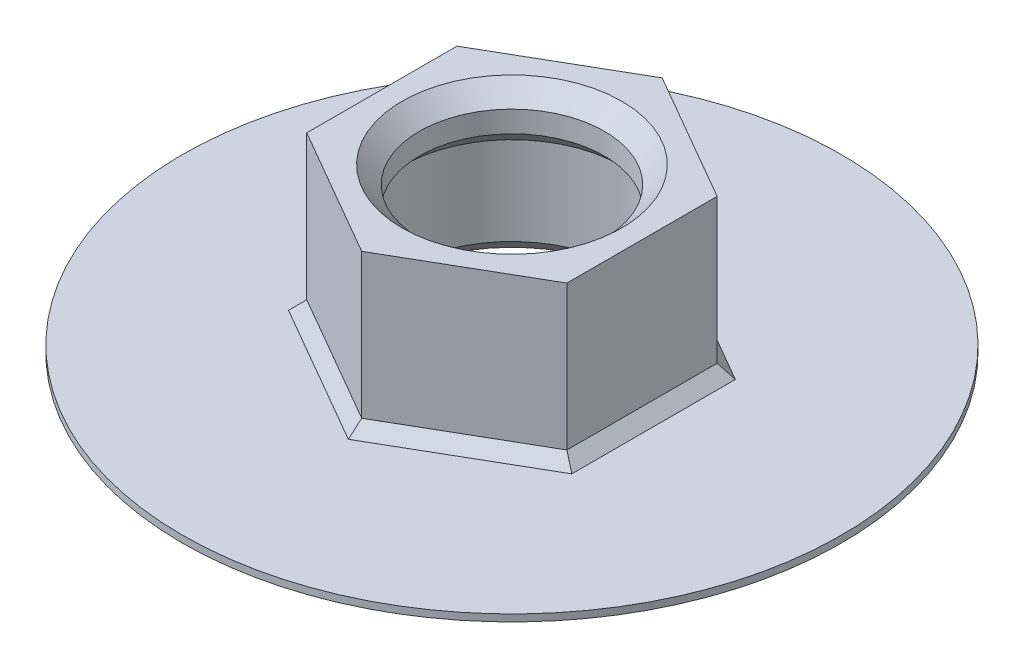
ISO-10303-21;
HEADER;
FILE_DESCRIPTION(('STEP AP214'),'2;1');
FILE_NAME('part.step','',(''),(''),'','','');
FILE_SCHEMA(('AUTOMOTIVE_DESIGN { 1 0 10303 214 1 1 1 1 }'));
ENDSEC;
DATA;
#1=APPLICATION_CONTEXT('core data for automotive mechanical design processes');
#2=APPLICATION_PROTOCOL_DEFINITION('international standard','automotive_design',2000,#1);
#3=PRODUCT_CONTEXT('',#1,'mechanical');
#4=PRODUCT('Part','Part','',(#3));
#5=PRODUCT_RELATED_PRODUCT_CATEGORY('part','',(#4));
#6=PRODUCT_DEFINITION_FORMATION('','',#4);
#7=PRODUCT_DEFINITION_CONTEXT('part definition',#1,'design');
#8=PRODUCT_DEFINITION('design','',#6,#7);
#9=PRODUCT_DEFINITION_SHAPE('','',#8);
#10=(LENGTH_UNIT() NAMED_UNIT(*) SI_UNIT(.MILLI.,.METRE.));
#11=(NAMED_UNIT(*) PLANE_ANGLE_UNIT() SI_UNIT($,.RADIAN.));
#12=(NAMED_UNIT(*) SI_UNIT($,.STERADIAN.) SOLID_ANGLE_UNIT());
#13=UNCERTAINTY_MEASURE_WITH_UNIT(LENGTH_MEASURE(1.E-05),#10,'distance_accuracy_value','');
#14=(GEOMETRIC_REPRESENTATION_CONTEXT(3) GLOBAL_UNCERTAINTY_ASSIGNED_CONTEXT((#13)) GLOBAL_UNIT_ASSIGNED_CONTEXT((#10,
#11,#12)) REPRESENTATION_CONTEXT('',''));
#15=CARTESIAN_POINT('',(0.,0.,0.));
#16=DIRECTION('',(0.,0.,1.));
#17=DIRECTION('',(1.,0.,0.));
#18=AXIS2_PLACEMENT_3D('',#15,#16,#17);
#19=CARTESIAN_POINT('',(0.,0.,0.));
#20=DIRECTION('',(0.,1.,0.));
#21=DIRECTION('',(0.,0.,1.));
#22=AXIS2_PLACEMENT_3D('',#19,#20,#21);
#23=PLANE('',#22);
#24=CARTESIAN_POINT('',(0.,0.,0.));
#25=DIRECTION('',(0.,1.,0.));
#26=DIRECTION('',(0.,0.,1.));
#27=AXIS2_PLACEMENT_3D('',#24,#25,#26);
#28=CIRCLE('',#27,11.175);
#29=CARTESIAN_POINT('',(0.,0.,11.175));
#30=VERTEX_POINT('',#29);
#31=EDGE_CURVE('E153',#30,#30,#28,.T.);
#32=ORIENTED_EDGE('',*,*,#31,.T.);
#33=EDGE_LOOP('',(#32));
#34=FACE_BOUND('',#33,.T.);
#35=CARTESIAN_POINT('',(0.,0.,0.));
#36=DIRECTION('',(0.,1.,0.));
#37=DIRECTION('',(0.,0.,1.));
#38=AXIS2_PLACEMENT_3D('',#35,#36,#37);
#39=CIRCLE('',#38,28.5);
#40=CARTESIAN_POINT('',(0.,0.,28.5));
#41=VERTEX_POINT('',#40);
#42=EDGE_CURVE('E183',#41,#41,#39,.F.);
#43=ORIENTED_EDGE('',*,*,#42,.T.);
#44=EDGE_LOOP('',(#43));
#45=FACE_BOUND('',#44,.T.);
#46=ADVANCED_FACE('F38',(#34,#45),#23,.F.);
#47=CARTESIAN_POINT('',(0.,0.6,0.));
#48=DIRECTION('',(0.,-1.,0.));
#49=DIRECTION('',(0.,0.,-1.));
#50=AXIS2_PLACEMENT_3D('',#47,#48,#49);
#51=CYLINDRICAL_SURFACE('',#50,9.675);
#52=CARTESIAN_POINT('',(0.,1.5,0.));
#53=DIRECTION('',(0.,1.,0.));
#54=DIRECTION('',(0.,0.,1.));
#55=AXIS2_PLACEMENT_3D('',#52,#53,#54);
#56=CIRCLE('',#55,9.675);
#57=CARTESIAN_POINT('',(0.,1.5,9.675));
#58=VERTEX_POINT('',#57);
#59=EDGE_CURVE('E156',#58,#58,#56,.F.);
#60=ORIENTED_EDGE('',*,*,#59,.T.);
#61=EDGE_LOOP('',(#60));
#62=FACE_BOUND('',#61,.T.);
#63=CARTESIAN_POINT('',(0.,9.25,0.));
#64=DIRECTION('',(0.,1.,0.));
#65=DIRECTION('',(0.,0.,1.));
#66=AXIS2_PLACEMENT_3D('',#63,#64,#65);
#67=CIRCLE('',#66,9.675);
#68=CARTESIAN_POINT('',(0.,9.25,9.675));
#69=VERTEX_POINT('',#68);
#70=EDGE_CURVE('E128',#69,#69,#67,.T.);
#71=ORIENTED_EDGE('',*,*,#70,.T.);
#72=EDGE_LOOP('',(#71));
#73=FACE_BOUND('',#72,.T.);
#74=ADVANCED_FACE('F261',(#62,#73),#51,.F.);
#75=CARTESIAN_POINT('',(0.,0.6,0.));
#76=DIRECTION('',(0.,1.,0.));
#77=DIRECTION('',(0.,0.,1.));
#78=AXIS2_PLACEMENT_3D('',#75,#76,#77);
#79=PLANE('',#78);
#80=DIRECTION('',(0.,0.,1.));
#81=VECTOR('',#80,1.);
#82=CARTESIAN_POINT('',(12.25,0.6,0.));
#83=LINE('',#82,#81);
#84=CARTESIAN_POINT('',(12.25,0.6,-7.07254079757292));
#85=VERTEX_POINT('',#84);
#86=CARTESIAN_POINT('',(12.25,0.6,7.07254079757292));
#87=VERTEX_POINT('',#86);
#88=EDGE_CURVE('E170',#85,#87,#83,.T.);
#89=ORIENTED_EDGE('',*,*,#88,.T.);
#90=DIRECTION('',(-0.866025403784439,0.,0.5));
#91=VECTOR('',#90,1.);
#92=CARTESIAN_POINT('',(6.125,0.6,10.6088111963594));
#93=LINE('',#92,#91);
#94=CARTESIAN_POINT('',(0.,0.6,14.1450815951458));
#95=VERTEX_POINT('',#94);
#96=EDGE_CURVE('E172',#87,#95,#93,.T.);
#97=ORIENTED_EDGE('',*,*,#96,.T.);
#98=DIRECTION('',(-0.866025403784439,0.,-0.5));
#99=VECTOR('',#98,1.);
#100=CARTESIAN_POINT('',(-6.125,0.6,10.6088111963594));
#101=LINE('',#100,#99);
#102=CARTESIAN_POINT('',(-12.25,0.6,7.07254079757292));
#103=VERTEX_POINT('',#102);
#104=EDGE_CURVE('E162',#95,#103,#101,.T.);
#105=ORIENTED_EDGE('',*,*,#104,.T.);
#106=DIRECTION('',(0.,0.,-1.));
#107=VECTOR('',#106,1.);
#108=CARTESIAN_POINT('',(-12.25,0.6,0.));
#109=LINE('',#108,#107);
#110=CARTESIAN_POINT('',(-12.25,0.6,-7.07254079757292));
#111=VERTEX_POINT('',#110);
#112=EDGE_CURVE('E164',#103,#111,#109,.T.);
#113=ORIENTED_EDGE('',*,*,#112,.T.);
#114=DIRECTION('',(0.866025403784439,0.,-0.5));
#115=VECTOR('',#114,1.);
#116=CARTESIAN_POINT('',(-6.125,0.6,-10.6088111963594));
#117=LINE('',#116,#115);
#118=CARTESIAN_POINT('',(0.,0.6,-14.1450815951458));
#119=VERTEX_POINT('',#118);
#120=EDGE_CURVE('E166',#111,#119,#117,.T.);
#121=ORIENTED_EDGE('',*,*,#120,.T.);
#122=DIRECTION('',(0.866025403784439,0.,0.5));
#123=VECTOR('',#122,1.);
#124=CARTESIAN_POINT('',(6.125,0.6,-10.6088111963594));
#125=LINE('',#124,#123);
#126=EDGE_CURVE('E168',#119,#85,#125,.T.);
#127=ORIENTED_EDGE('',*,*,#126,.T.);
#128=EDGE_LOOP('',(#89,#97,#105,#113,#121,#127));
#129=FACE_BOUND('',#128,.T.);
#130=CARTESIAN_POINT('',(0.,0.600000000000003,0.));
#131=DIRECTION('',(0.,1.,0.));
#132=DIRECTION('',(0.,0.,1.));
#133=AXIS2_PLACEMENT_3D('',#130,#131,#132);
#134=CIRCLE('',#133,28.5);
#135=CARTESIAN_POINT('',(0.,0.600000000000003,28.5));
#136=VERTEX_POINT('',#135);
#137=EDGE_CURVE('E143',#136,#136,#134,.F.);
#138=ORIENTED_EDGE('',*,*,#137,.F.);
#139=EDGE_LOOP('',(#138));
#140=FACE_BOUND('',#139,.T.);
#141=ADVANCED_FACE('F247',(#129,#140),#79,.T.);
#142=CARTESIAN_POINT('',(0.,14.1,0.));
#143=DIRECTION('',(0.,1.,0.));
#144=DIRECTION('',(0.,0.,1.));
#145=AXIS2_PLACEMENT_3D('',#142,#143,#144);
#146=PLANE('',#145);
#147=CARTESIAN_POINT('',(0.,14.1,0.));
#148=DIRECTION('',(0.,1.,0.));
#149=DIRECTION('',(0.,0.,1.));
#150=AXIS2_PLACEMENT_3D('',#147,#148,#149);
#151=CIRCLE('',#150,9.50000000000001);
#152=CARTESIAN_POINT('',(0.,14.1,9.50000000000001));
#153=VERTEX_POINT('',#152);
#154=EDGE_CURVE('E147',#153,#153,#151,.F.);
#155=ORIENTED_EDGE('',*,*,#154,.T.);
#156=EDGE_LOOP('',(#155));
#157=FACE_BOUND('',#156,.T.);
#158=DIRECTION('',(-0.866025403784439,0.,-0.5));
#159=VECTOR('',#158,1.);
#160=CARTESIAN_POINT('',(11.25,14.1,-6.4951905283833));
#161=LINE('',#160,#159);
#162=CARTESIAN_POINT('',(11.25,14.1,-6.4951905283833));
#163=VERTEX_POINT('',#162);
#164=CARTESIAN_POINT('',(0.,14.1,-12.9903810567666));
#165=VERTEX_POINT('',#164);
#166=EDGE_CURVE('E119',#163,#165,#161,.T.);
#167=ORIENTED_EDGE('',*,*,#166,.T.);
#168=DIRECTION('',(-0.866025403784439,0.,0.5));
#169=VECTOR('',#168,1.);
#170=CARTESIAN_POINT('',(0.,14.1,-12.9903810567666));
#171=LINE('',#170,#169);
#172=CARTESIAN_POINT('',(-11.25,14.1,-6.49519052838329));
#173=VERTEX_POINT('',#172);
#174=EDGE_CURVE('E110',#165,#173,#171,.T.);
#175=ORIENTED_EDGE('',*,*,#174,.T.);
#176=DIRECTION('',(0.,0.,1.));
#177=VECTOR('',#176,1.);
#178=CARTESIAN_POINT('',(-11.25,14.1,-6.49519052838329));
#179=LINE('',#178,#177);
#180=CARTESIAN_POINT('',(-11.25,14.1,6.49519052838329));
#181=VERTEX_POINT('',#180);
#182=EDGE_CURVE('E118',#173,#181,#179,.T.);
#183=ORIENTED_EDGE('',*,*,#182,.T.);
#184=DIRECTION('',(0.866025403784439,0.,0.5));
#185=VECTOR('',#184,1.);
#186=CARTESIAN_POINT('',(-11.25,14.1,6.49519052838329));
#187=LINE('',#186,#185);
#188=CARTESIAN_POINT('',(0.,14.1,12.9903810567666));
#189=VERTEX_POINT('',#188);
#190=EDGE_CURVE('E206',#181,#189,#187,.T.);
#191=ORIENTED_EDGE('',*,*,#190,.T.);
#192=DIRECTION('',(0.866025403784439,0.,-0.5));
#193=VECTOR('',#192,1.);
#194=CARTESIAN_POINT('',(0.,14.1,12.9903810567666));
#195=LINE('',#194,#193);
#196=CARTESIAN_POINT('',(11.25,14.1,6.49519052838329));
#197=VERTEX_POINT('',#196);
#198=EDGE_CURVE('E208',#189,#197,#195,.T.);
#199=ORIENTED_EDGE('',*,*,#198,.T.);
#200=DIRECTION('',(0.,0.,-1.));
#201=VECTOR('',#200,1.);
#202=CARTESIAN_POINT('',(11.25,14.1,6.49519052838329));
#203=LINE('',#202,#201);
#204=EDGE_CURVE('E124',#197,#163,#203,.T.);
#205=ORIENTED_EDGE('',*,*,#204,.T.);
#206=EDGE_LOOP('',(#167,#175,#183,#191,#199,#205));
#207=FACE_BOUND('',#206,.T.);
#208=ADVANCED_FACE('F122',(#157,#207),#146,.T.);
#209=CARTESIAN_POINT('',(11.25,14.1,-6.4951905283833));
#210=DIRECTION('',(-0.5,0.,0.866025403784439));
#211=DIRECTION('',(0.866025403784439,0.,0.5));
#212=AXIS2_PLACEMENT_3D('',#209,#210,#211);
#213=PLANE('',#212);
#214=DIRECTION('',(0.,-1.,0.));
#215=VECTOR('',#214,1.);
#216=CARTESIAN_POINT('',(11.25,14.1,-6.4951905283833));
#217=LINE('',#216,#215);
#218=CARTESIAN_POINT('',(11.25,1.60000000000001,-6.4951905283833));
#219=VERTEX_POINT('',#218);
#220=EDGE_CURVE('E211',#163,#219,#217,.T.);
#221=ORIENTED_EDGE('',*,*,#220,.T.);
#222=DIRECTION('',(-0.866025403784439,0.,-0.5));
#223=VECTOR('',#222,1.);
#224=CARTESIAN_POINT('',(11.25,1.60000000000001,-6.4951905283833));
#225=LINE('',#224,#223);
#226=CARTESIAN_POINT('',(0.,1.60000000000001,-12.9903810567666));
#227=VERTEX_POINT('',#226);
#228=EDGE_CURVE('E132',#219,#227,#225,.T.);
#229=ORIENTED_EDGE('',*,*,#228,.T.);
#230=DIRECTION('',(0.,-1.,0.));
#231=VECTOR('',#230,1.);
#232=CARTESIAN_POINT('',(0.,14.1,-12.9903810567666));
#233=LINE('',#232,#231);
#234=EDGE_CURVE('E114',#165,#227,#233,.T.);
#235=ORIENTED_EDGE('',*,*,#234,.F.);
#236=ORIENTED_EDGE('',*,*,#166,.F.);
#237=EDGE_LOOP('',(#221,#229,#235,#236));
#238=FACE_BOUND('',#237,.T.);
#239=ADVANCED_FACE('F130',(#238),#213,.F.);
#240=CARTESIAN_POINT('',(0.,14.1,-12.9903810567666));
#241=DIRECTION('',(0.5,0.,0.866025403784439));
#242=DIRECTION('',(0.866025403784439,0.,-0.5));
#243=AXIS2_PLACEMENT_3D('',#240,#241,#242);
#244=PLANE('',#243);
#245=ORIENTED_EDGE('',*,*,#234,.T.);
#246=DIRECTION('',(-0.866025403784439,0.,0.5));
#247=VECTOR('',#246,1.);
#248=CARTESIAN_POINT('',(0.,1.60000000000001,-12.9903810567666));
#249=LINE('',#248,#247);
#250=CARTESIAN_POINT('',(-11.25,1.60000000000001,-6.49519052838329));
#251=VERTEX_POINT('',#250);
#252=EDGE_CURVE('E63',#227,#251,#249,.T.);
#253=ORIENTED_EDGE('',*,*,#252,.T.);
#254=DIRECTION('',(0.,-1.,0.));
#255=VECTOR('',#254,1.);
#256=CARTESIAN_POINT('',(-11.25,14.1,-6.49519052838329));
#257=LINE('',#256,#255);
#258=EDGE_CURVE('E115',#173,#251,#257,.T.);
#259=ORIENTED_EDGE('',*,*,#258,.F.);
#260=ORIENTED_EDGE('',*,*,#174,.F.);
#261=EDGE_LOOP('',(#245,#253,#259,#260));
#262=FACE_BOUND('',#261,.T.);
#263=ADVANCED_FACE('F112',(#262),#244,.F.);
#264=CARTESIAN_POINT('',(-11.25,14.1,-6.49519052838329));
#265=DIRECTION('',(1.,0.,0.));
#266=DIRECTION('',(0.,0.,-1.));
#267=AXIS2_PLACEMENT_3D('',#264,#265,#266);
#268=PLANE('',#267);
#269=ORIENTED_EDGE('',*,*,#258,.T.);
#270=DIRECTION('',(0.,0.,1.));
#271=VECTOR('',#270,1.);
#272=CARTESIAN_POINT('',(-11.25,1.60000000000001,-6.49519052838329));
#273=LINE('',#272,#271);
#274=CARTESIAN_POINT('',(-11.25,1.60000000000001,6.49519052838329));
#275=VERTEX_POINT('',#274);
#276=EDGE_CURVE('E48',#251,#275,#273,.T.);
#277=ORIENTED_EDGE('',*,*,#276,.T.);
#278=DIRECTION('',(0.,-1.,0.));
#279=VECTOR('',#278,1.);
#280=CARTESIAN_POINT('',(-11.25,14.1,6.49519052838329));
#281=LINE('',#280,#279);
#282=EDGE_CURVE('E138',#181,#275,#281,.T.);
#283=ORIENTED_EDGE('',*,*,#282,.F.);
#284=ORIENTED_EDGE('',*,*,#182,.F.);
#285=EDGE_LOOP('',(#269,#277,#283,#284));
#286=FACE_BOUND('',#285,.T.);
#287=ADVANCED_FACE('F395',(#286),#268,.F.);
#288=CARTESIAN_POINT('',(-11.25,14.1,6.49519052838329));
#289=DIRECTION('',(0.5,0.,-0.866025403784439));
#290=DIRECTION('',(-0.866025403784439,0.,-0.5));
#291=AXIS2_PLACEMENT_3D('',#288,#289,#290);
#292=PLANE('',#291);
#293=ORIENTED_EDGE('',*,*,#282,.T.);
#294=DIRECTION('',(0.866025403784439,0.,0.5));
#295=VECTOR('',#294,1.);
#296=CARTESIAN_POINT('',(-11.25,1.60000000000001,6.49519052838329));
#297=LINE('',#296,#295);
#298=CARTESIAN_POINT('',(0.,1.60000000000001,12.9903810567666));
#299=VERTEX_POINT('',#298);
#300=EDGE_CURVE('E12',#275,#299,#297,.T.);
#301=ORIENTED_EDGE('',*,*,#300,.T.);
#302=DIRECTION('',(0.,-1.,0.));
#303=VECTOR('',#302,1.);
#304=CARTESIAN_POINT('',(0.,14.1,12.9903810567666));
#305=LINE('',#304,#303);
#306=EDGE_CURVE('E216',#189,#299,#305,.T.);
#307=ORIENTED_EDGE('',*,*,#306,.F.);
#308=ORIENTED_EDGE('',*,*,#190,.F.);
#309=EDGE_LOOP('',(#293,#301,#307,#308));
#310=FACE_BOUND('',#309,.T.);
#311=ADVANCED_FACE('F221',(#310),#292,.F.);
#312=CARTESIAN_POINT('',(0.,14.1,12.9903810567666));
#313=DIRECTION('',(-0.5,0.,-0.866025403784439));
#314=DIRECTION('',(-0.866025403784439,0.,0.5));
#315=AXIS2_PLACEMENT_3D('',#312,#313,#314);
#316=PLANE('',#315);
#317=ORIENTED_EDGE('',*,*,#306,.T.);
#318=DIRECTION('',(0.866025403784439,0.,-0.5));
#319=VECTOR('',#318,1.);
#320=CARTESIAN_POINT('',(0.,1.60000000000001,12.9903810567666));
#321=LINE('',#320,#319);
#322=CARTESIAN_POINT('',(11.25,1.60000000000001,6.49519052838329));
#323=VERTEX_POINT('',#322);
#324=EDGE_CURVE('E159',#299,#323,#321,.T.);
#325=ORIENTED_EDGE('',*,*,#324,.T.);
#326=DIRECTION('',(0.,-1.,0.));
#327=VECTOR('',#326,1.);
#328=CARTESIAN_POINT('',(11.25,14.1,6.49519052838329));
#329=LINE('',#328,#327);
#330=EDGE_CURVE('E213',#197,#323,#329,.T.);
#331=ORIENTED_EDGE('',*,*,#330,.F.);
#332=ORIENTED_EDGE('',*,*,#198,.F.);
#333=EDGE_LOOP('',(#317,#325,#331,#332));
#334=FACE_BOUND('',#333,.T.);
#335=ADVANCED_FACE('F237',(#334),#316,.F.);
#336=CARTESIAN_POINT('',(11.25,14.1,6.49519052838329));
#337=DIRECTION('',(-1.,0.,0.));
#338=DIRECTION('',(0.,0.,1.));
#339=AXIS2_PLACEMENT_3D('',#336,#337,#338);
#340=PLANE('',#339);
#341=ORIENTED_EDGE('',*,*,#330,.T.);
#342=DIRECTION('',(0.,0.,-1.));
#343=VECTOR('',#342,1.);
#344=CARTESIAN_POINT('',(11.25,1.60000000000001,6.49519052838329));
#345=LINE('',#344,#343);
#346=EDGE_CURVE('E175',#323,#219,#345,.T.);
#347=ORIENTED_EDGE('',*,*,#346,.T.);
#348=ORIENTED_EDGE('',*,*,#220,.F.);
#349=ORIENTED_EDGE('',*,*,#204,.F.);
#350=EDGE_LOOP('',(#341,#347,#348,#349));
#351=FACE_BOUND('',#350,.T.);
#352=ADVANCED_FACE('F240',(#351),#340,.F.);
#353=CARTESIAN_POINT('',(0.,9.25,0.));
#354=DIRECTION('',(0.,1.,0.));
#355=DIRECTION('',(0.,0.,1.));
#356=AXIS2_PLACEMENT_3D('',#353,#354,#355);
#357=PLANE('',#356);
#358=CARTESIAN_POINT('',(0.,9.25,0.));
#359=DIRECTION('',(0.,1.,0.));
#360=DIRECTION('',(0.,0.,1.));
#361=AXIS2_PLACEMENT_3D('',#358,#359,#360);
#362=CIRCLE('',#361,9.50000000000003);
#363=CARTESIAN_POINT('',(0.,9.25,9.50000000000003));
#364=VERTEX_POINT('',#363);
#365=EDGE_CURVE('E150',#364,#364,#362,.T.);
#366=ORIENTED_EDGE('',*,*,#365,.T.);
#367=EDGE_LOOP('',(#366));
#368=FACE_BOUND('',#367,.T.);
#369=ORIENTED_EDGE('',*,*,#70,.F.);
#370=EDGE_LOOP('',(#369));
#371=FACE_BOUND('',#370,.T.);
#372=ADVANCED_FACE('F367',(#368,#371),#357,.F.);
#373=CARTESIAN_POINT('',(0.,-28.4073740507555,0.));
#374=DIRECTION('',(0.,1.,0.));
#375=DIRECTION('',(0.,0.,1.));
#376=AXIS2_PLACEMENT_3D('',#373,#374,#375);
#377=CYLINDRICAL_SURFACE('',#376,8.);
#378=CARTESIAN_POINT('',(0.,12.6,0.));
#379=DIRECTION('',(0.,1.,0.));
#380=DIRECTION('',(0.,0.,1.));
#381=AXIS2_PLACEMENT_3D('',#378,#379,#380);
#382=CIRCLE('',#381,8.);
#383=CARTESIAN_POINT('',(0.,12.6,8.));
#384=VERTEX_POINT('',#383);
#385=EDGE_CURVE('E136',#384,#384,#382,.T.);
#386=ORIENTED_EDGE('',*,*,#385,.T.);
#387=EDGE_LOOP('',(#386));
#388=FACE_BOUND('',#387,.T.);
#389=CARTESIAN_POINT('',(0.,10.75,0.));
#390=DIRECTION('',(0.,1.,0.));
#391=DIRECTION('',(0.,0.,1.));
#392=AXIS2_PLACEMENT_3D('',#389,#390,#391);
#393=CIRCLE('',#392,8.);
#394=CARTESIAN_POINT('',(0.,10.75,8.));
#395=VERTEX_POINT('',#394);
#396=EDGE_CURVE('E133',#395,#395,#393,.F.);
#397=ORIENTED_EDGE('',*,*,#396,.T.);
#398=EDGE_LOOP('',(#397));
#399=FACE_BOUND('',#398,.T.);
#400=ADVANCED_FACE('F280',(#388,#399),#377,.F.);
#401=CARTESIAN_POINT('',(0.,12.6,0.));
#402=DIRECTION('',(0.,1.,0.));
#403=DIRECTION('',(0.,0.,1.));
#404=AXIS2_PLACEMENT_3D('',#401,#402,#403);
#405=CONICAL_SURFACE('',#404,8.,0.785398163397448);
#406=ORIENTED_EDGE('',*,*,#154,.F.);
#407=EDGE_LOOP('',(#406));
#408=FACE_BOUND('',#407,.T.);
#409=ORIENTED_EDGE('',*,*,#385,.F.);
#410=EDGE_LOOP('',(#409));
#411=FACE_BOUND('',#410,.T.);
#412=ADVANCED_FACE('F273',(#408,#411),#405,.F.);
#413=CARTESIAN_POINT('',(0.,10.75,0.));
#414=DIRECTION('',(0.,-1.,0.));
#415=DIRECTION('',(0.,0.,-1.));
#416=AXIS2_PLACEMENT_3D('',#413,#414,#415);
#417=CONICAL_SURFACE('',#416,8.,0.785398163397454);
#418=ORIENTED_EDGE('',*,*,#365,.F.);
#419=EDGE_LOOP('',(#418));
#420=FACE_BOUND('',#419,.T.);
#421=ORIENTED_EDGE('',*,*,#396,.F.);
#422=EDGE_LOOP('',(#421));
#423=FACE_BOUND('',#422,.T.);
#424=ADVANCED_FACE('F279',(#420,#423),#417,.F.);
#425=CARTESIAN_POINT('',(0.,0.,0.));
#426=DIRECTION('',(0.,-1.,0.));
#427=DIRECTION('',(0.,0.,-1.));
#428=AXIS2_PLACEMENT_3D('',#425,#426,#427);
#429=CONICAL_SURFACE('',#428,11.175,0.785398163397448);
#430=ORIENTED_EDGE('',*,*,#59,.F.);
#431=EDGE_LOOP('',(#430));
#432=FACE_BOUND('',#431,.T.);
#433=ORIENTED_EDGE('',*,*,#31,.F.);
#434=EDGE_LOOP('',(#433));
#435=FACE_BOUND('',#434,.T.);
#436=ADVANCED_FACE('F257',(#432,#435),#429,.F.);
#437=CARTESIAN_POINT('',(0.,81.2101730552664,0.));
#438=DIRECTION('',(0.,-1.,0.));
#439=DIRECTION('',(0.,0.,-1.));
#440=AXIS2_PLACEMENT_3D('',#437,#438,#439);
#441=CYLINDRICAL_SURFACE('',#440,28.5);
#442=ORIENTED_EDGE('',*,*,#42,.F.);
#443=EDGE_LOOP('',(#442));
#444=FACE_BOUND('',#443,.T.);
#445=ORIENTED_EDGE('',*,*,#137,.T.);
#446=EDGE_LOOP('',(#445));
#447=FACE_BOUND('',#446,.T.);
#448=ADVANCED_FACE('F252',(#444,#447),#441,.T.);
#449=CARTESIAN_POINT('',(0.,1.60000000000001,-12.9903810567666));
#450=DIRECTION('',(0.353553390593275,-0.707106781186545,0.612372435695797));
#451=DIRECTION('',(-0.866025403784439,0.,0.5));
#452=AXIS2_PLACEMENT_3D('',#449,#450,#451);
#453=PLANE('',#452);
#454=DIRECTION('',(0.,-0.654653670707981,-0.755928946018451));
#455=VECTOR('',#454,1.);
#456=CARTESIAN_POINT('',(0.,1.60000000000001,-12.9903810567666));
#457=LINE('',#456,#455);
#458=EDGE_CURVE('E190',#119,#227,#457,.F.);
#459=ORIENTED_EDGE('',*,*,#458,.F.);
#460=ORIENTED_EDGE('',*,*,#120,.F.);
#461=DIRECTION('',(-0.654653670707974,-0.654653670707981,-0.377964473009227));
#462=VECTOR('',#461,1.);
#463=CARTESIAN_POINT('',(-11.25,1.60000000000001,-6.49519052838329));
#464=LINE('',#463,#462);
#465=EDGE_CURVE('E43',#251,#111,#464,.T.);
#466=ORIENTED_EDGE('',*,*,#465,.F.);
#467=ORIENTED_EDGE('',*,*,#252,.F.);
#468=EDGE_LOOP('',(#459,#460,#466,#467));
#469=FACE_BOUND('',#468,.T.);
#470=ADVANCED_FACE('F41',(#469),#453,.F.);
#471=CARTESIAN_POINT('',(-11.25,1.60000000000001,-6.49519052838329));
#472=DIRECTION('',(0.707106781186551,-0.707106781186544,0.));
#473=DIRECTION('',(0.,0.,1.));
#474=AXIS2_PLACEMENT_3D('',#471,#472,#473);
#475=PLANE('',#474);
#476=ORIENTED_EDGE('',*,*,#465,.T.);
#477=ORIENTED_EDGE('',*,*,#112,.F.);
#478=DIRECTION('',(-0.654653670707974,-0.654653670707981,0.377964473009226));
#479=VECTOR('',#478,1.);
#480=CARTESIAN_POINT('',(-11.25,1.60000000000001,6.49519052838329));
#481=LINE('',#480,#479);
#482=EDGE_CURVE('E188',#275,#103,#481,.T.);
#483=ORIENTED_EDGE('',*,*,#482,.F.);
#484=ORIENTED_EDGE('',*,*,#276,.F.);
#485=EDGE_LOOP('',(#476,#477,#483,#484));
#486=FACE_BOUND('',#485,.T.);
#487=ADVANCED_FACE('F224',(#486),#475,.F.);
#488=CARTESIAN_POINT('',(11.25,1.60000000000001,-6.4951905283833));
#489=DIRECTION('',(-0.353553390593276,-0.707106781186544,0.612372435695798));
#490=DIRECTION('',(-0.866025403784439,0.,-0.5));
#491=AXIS2_PLACEMENT_3D('',#488,#489,#490);
#492=PLANE('',#491);
#493=ORIENTED_EDGE('',*,*,#458,.T.);
#494=ORIENTED_EDGE('',*,*,#228,.F.);
#495=DIRECTION('',(0.654653670707976,-0.654653670707981,-0.377964473009224));
#496=VECTOR('',#495,1.);
#497=CARTESIAN_POINT('',(11.25,1.60000000000001,-6.4951905283833));
#498=LINE('',#497,#496);
#499=EDGE_CURVE('E185',#85,#219,#498,.F.);
#500=ORIENTED_EDGE('',*,*,#499,.F.);
#501=ORIENTED_EDGE('',*,*,#126,.F.);
#502=EDGE_LOOP('',(#493,#494,#500,#501));
#503=FACE_BOUND('',#502,.T.);
#504=ADVANCED_FACE('F242',(#503),#492,.F.);
#505=CARTESIAN_POINT('',(-11.25,1.60000000000001,6.49519052838329));
#506=DIRECTION('',(0.353553390593276,-0.707106781186544,-0.612372435695798));
#507=DIRECTION('',(0.866025403784439,0.,0.5));
#508=AXIS2_PLACEMENT_3D('',#505,#506,#507);
#509=PLANE('',#508);
#510=ORIENTED_EDGE('',*,*,#482,.T.);
#511=ORIENTED_EDGE('',*,*,#104,.F.);
#512=DIRECTION('',(0.,0.654653670707981,-0.755928946018451));
#513=VECTOR('',#512,1.);
#514=CARTESIAN_POINT('',(0.,4.81428571428574,9.27884361197615));
#515=LINE('',#514,#513);
#516=EDGE_CURVE('E182',#299,#95,#515,.F.);
#517=ORIENTED_EDGE('',*,*,#516,.F.);
#518=ORIENTED_EDGE('',*,*,#300,.F.);
#519=EDGE_LOOP('',(#510,#511,#517,#518));
#520=FACE_BOUND('',#519,.T.);
#521=ADVANCED_FACE('F228',(#520),#509,.F.);
#522=CARTESIAN_POINT('',(11.25,1.60000000000001,6.49519052838329));
#523=DIRECTION('',(-0.70710678118655,-0.707106781186545,0.));
#524=DIRECTION('',(0.,0.,-1.));
#525=AXIS2_PLACEMENT_3D('',#522,#523,#524);
#526=PLANE('',#525);
#527=ORIENTED_EDGE('',*,*,#499,.T.);
#528=ORIENTED_EDGE('',*,*,#346,.F.);
#529=DIRECTION('',(0.654653670707975,-0.65465367070798,0.377964473009225));
#530=VECTOR('',#529,1.);
#531=CARTESIAN_POINT('',(11.25,1.60000000000001,6.49519052838329));
#532=LINE('',#531,#530);
#533=EDGE_CURVE('E180',#87,#323,#532,.F.);
#534=ORIENTED_EDGE('',*,*,#533,.F.);
#535=ORIENTED_EDGE('',*,*,#88,.F.);
#536=EDGE_LOOP('',(#527,#528,#534,#535));
#537=FACE_BOUND('',#536,.T.);
#538=ADVANCED_FACE('F245',(#537),#526,.F.);
#539=CARTESIAN_POINT('',(0.,1.60000000000001,12.9903810567666));
#540=DIRECTION('',(-0.353553390593276,-0.707106781186544,-0.612372435695797));
#541=DIRECTION('',(0.866025403784439,0.,-0.5));
#542=AXIS2_PLACEMENT_3D('',#539,#540,#541);
#543=PLANE('',#542);
#544=ORIENTED_EDGE('',*,*,#516,.T.);
#545=ORIENTED_EDGE('',*,*,#96,.F.);
#546=ORIENTED_EDGE('',*,*,#533,.T.);
#547=ORIENTED_EDGE('',*,*,#324,.F.);
#548=EDGE_LOOP('',(#544,#545,#546,#547));
#549=FACE_BOUND('',#548,.T.);
#550=ADVANCED_FACE('F232',(#549),#543,.F.);
#551=CLOSED_SHELL('',(#46,#74,#141,#208,#239,#263,#287,#311,#335,#352,#372,#400,#412,#424,#436,
#448,#470,#487,#504,#521,#538,#550));
#552=MANIFOLD_SOLID_BREP('B2',#551);
#553=ADVANCED_BREP_SHAPE_REPRESENTATION('',(#18,#552),#14);
#554=SHAPE_DEFINITION_REPRESENTATION(#9,#553);
ENDSEC;
END-ISO-10303-21;
